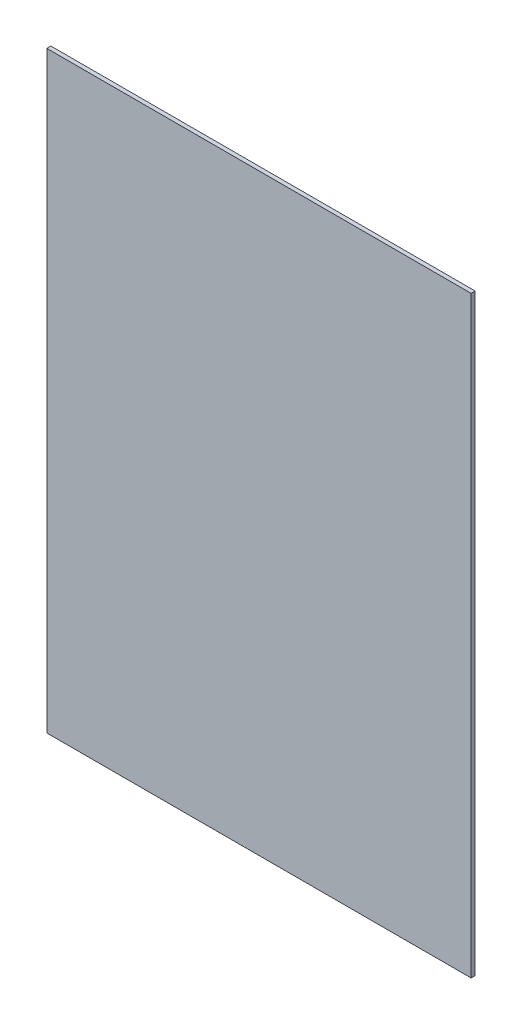
ISO-10303-21;
HEADER;
FILE_DESCRIPTION(('STEP AP214'),'2;1');
FILE_NAME('part.step','',(''),(''),'','','');
FILE_SCHEMA(('AUTOMOTIVE_DESIGN { 1 0 10303 214 1 1 1 1 }'));
ENDSEC;
DATA;
#1=APPLICATION_CONTEXT('core data for automotive mechanical design processes');
#2=APPLICATION_PROTOCOL_DEFINITION('international standard','automotive_design',2000,#1);
#3=PRODUCT_CONTEXT('',#1,'mechanical');
#4=PRODUCT('Part','Part','',(#3));
#5=PRODUCT_RELATED_PRODUCT_CATEGORY('part','',(#4));
#6=PRODUCT_DEFINITION_FORMATION('','',#4);
#7=PRODUCT_DEFINITION_CONTEXT('part definition',#1,'design');
#8=PRODUCT_DEFINITION('design','',#6,#7);
#9=PRODUCT_DEFINITION_SHAPE('','',#8);
#10=(LENGTH_UNIT() NAMED_UNIT(*) SI_UNIT(.MILLI.,.METRE.));
#11=(NAMED_UNIT(*) PLANE_ANGLE_UNIT() SI_UNIT($,.RADIAN.));
#12=(NAMED_UNIT(*) SI_UNIT($,.STERADIAN.) SOLID_ANGLE_UNIT());
#13=UNCERTAINTY_MEASURE_WITH_UNIT(LENGTH_MEASURE(1.E-05),#10,'distance_accuracy_value','');
#14=(GEOMETRIC_REPRESENTATION_CONTEXT(3) GLOBAL_UNCERTAINTY_ASSIGNED_CONTEXT((#13)) GLOBAL_UNIT_ASSIGNED_CONTEXT((#10,
#11,#12)) REPRESENTATION_CONTEXT('',''));
#15=CARTESIAN_POINT('',(0.,0.,0.));
#16=DIRECTION('',(0.,0.,1.));
#17=DIRECTION('',(1.,0.,0.));
#18=AXIS2_PLACEMENT_3D('',#15,#16,#17);
#19=CARTESIAN_POINT('',(340.,-475.,6.5));
#20=DIRECTION('',(-1.,0.,0.));
#21=DIRECTION('',(0.,0.,1.));
#22=AXIS2_PLACEMENT_3D('',#19,#20,#21);
#23=PLANE('',#22);
#24=DIRECTION('',(0.,1.,0.));
#25=VECTOR('',#24,1.);
#26=CARTESIAN_POINT('',(340.,-475.,0.));
#27=LINE('',#26,#25);
#28=CARTESIAN_POINT('',(340.,-475.,0.));
#29=VERTEX_POINT('',#28);
#30=CARTESIAN_POINT('',(340.,475.,0.));
#31=VERTEX_POINT('',#30);
#32=EDGE_CURVE('E95',#29,#31,#27,.T.);
#33=ORIENTED_EDGE('',*,*,#32,.T.);
#34=DIRECTION('',(0.,0.,-1.));
#35=VECTOR('',#34,1.);
#36=CARTESIAN_POINT('',(340.,475.,6.5));
#37=LINE('',#36,#35);
#38=CARTESIAN_POINT('',(340.,475.,6.5));
#39=VERTEX_POINT('',#38);
#40=EDGE_CURVE('E11',#39,#31,#37,.T.);
#41=ORIENTED_EDGE('',*,*,#40,.F.);
#42=DIRECTION('',(0.,1.,0.));
#43=VECTOR('',#42,1.);
#44=CARTESIAN_POINT('',(340.,-475.,6.5));
#45=LINE('',#44,#43);
#46=CARTESIAN_POINT('',(340.,-475.,6.5));
#47=VERTEX_POINT('',#46);
#48=EDGE_CURVE('E83',#47,#39,#45,.T.);
#49=ORIENTED_EDGE('',*,*,#48,.F.);
#50=DIRECTION('',(0.,0.,-1.));
#51=VECTOR('',#50,1.);
#52=CARTESIAN_POINT('',(340.,-475.,6.5));
#53=LINE('',#52,#51);
#54=EDGE_CURVE('E91',#47,#29,#53,.T.);
#55=ORIENTED_EDGE('',*,*,#54,.T.);
#56=EDGE_LOOP('',(#33,#41,#49,#55));
#57=FACE_BOUND('',#56,.T.);
#58=ADVANCED_FACE('F32',(#57),#23,.F.);
#59=CARTESIAN_POINT('',(-340.,475.,6.5));
#60=DIRECTION('',(0.,-1.,0.));
#61=DIRECTION('',(0.,0.,-1.));
#62=AXIS2_PLACEMENT_3D('',#59,#60,#61);
#63=PLANE('',#62);
#64=DIRECTION('',(-1.,0.,0.));
#65=VECTOR('',#64,1.);
#66=CARTESIAN_POINT('',(-340.,475.,0.));
#67=LINE('',#66,#65);
#68=CARTESIAN_POINT('',(-340.,475.,0.));
#69=VERTEX_POINT('',#68);
#70=EDGE_CURVE('E87',#31,#69,#67,.T.);
#71=ORIENTED_EDGE('',*,*,#70,.T.);
#72=DIRECTION('',(0.,0.,-1.));
#73=VECTOR('',#72,1.);
#74=CARTESIAN_POINT('',(-340.,475.,6.5));
#75=LINE('',#74,#73);
#76=CARTESIAN_POINT('',(-340.,475.,6.5));
#77=VERTEX_POINT('',#76);
#78=EDGE_CURVE('E40',#77,#69,#75,.T.);
#79=ORIENTED_EDGE('',*,*,#78,.F.);
#80=DIRECTION('',(-1.,0.,0.));
#81=VECTOR('',#80,1.);
#82=CARTESIAN_POINT('',(-340.,475.,6.5));
#83=LINE('',#82,#81);
#84=EDGE_CURVE('E78',#39,#77,#83,.T.);
#85=ORIENTED_EDGE('',*,*,#84,.F.);
#86=ORIENTED_EDGE('',*,*,#40,.T.);
#87=EDGE_LOOP('',(#71,#79,#85,#86));
#88=FACE_BOUND('',#87,.T.);
#89=ADVANCED_FACE('F86',(#88),#63,.F.);
#90=CARTESIAN_POINT('',(-340.,-475.,6.5));
#91=DIRECTION('',(1.,0.,0.));
#92=DIRECTION('',(0.,0.,-1.));
#93=AXIS2_PLACEMENT_3D('',#90,#91,#92);
#94=PLANE('',#93);
#95=DIRECTION('',(0.,-1.,0.));
#96=VECTOR('',#95,1.);
#97=CARTESIAN_POINT('',(-340.,-475.,0.));
#98=LINE('',#97,#96);
#99=CARTESIAN_POINT('',(-340.,-475.,0.));
#100=VERTEX_POINT('',#99);
#101=EDGE_CURVE('E65',#69,#100,#98,.T.);
#102=ORIENTED_EDGE('',*,*,#101,.T.);
#103=DIRECTION('',(0.,0.,-1.));
#104=VECTOR('',#103,1.);
#105=CARTESIAN_POINT('',(-340.,-475.,6.5));
#106=LINE('',#105,#104);
#107=CARTESIAN_POINT('',(-340.,-475.,6.5));
#108=VERTEX_POINT('',#107);
#109=EDGE_CURVE('E88',#108,#100,#106,.T.);
#110=ORIENTED_EDGE('',*,*,#109,.F.);
#111=DIRECTION('',(0.,-1.,0.));
#112=VECTOR('',#111,1.);
#113=CARTESIAN_POINT('',(-340.,-475.,6.5));
#114=LINE('',#113,#112);
#115=EDGE_CURVE('E81',#77,#108,#114,.T.);
#116=ORIENTED_EDGE('',*,*,#115,.F.);
#117=ORIENTED_EDGE('',*,*,#78,.T.);
#118=EDGE_LOOP('',(#102,#110,#116,#117));
#119=FACE_BOUND('',#118,.T.);
#120=ADVANCED_FACE('F89',(#119),#94,.F.);
#121=CARTESIAN_POINT('',(-340.,-475.,6.5));
#122=DIRECTION('',(0.,1.,0.));
#123=DIRECTION('',(0.,0.,1.));
#124=AXIS2_PLACEMENT_3D('',#121,#122,#123);
#125=PLANE('',#124);
#126=DIRECTION('',(1.,0.,0.));
#127=VECTOR('',#126,1.);
#128=CARTESIAN_POINT('',(-340.,-475.,0.));
#129=LINE('',#128,#127);
#130=EDGE_CURVE('E71',#100,#29,#129,.T.);
#131=ORIENTED_EDGE('',*,*,#130,.T.);
#132=ORIENTED_EDGE('',*,*,#54,.F.);
#133=DIRECTION('',(1.,0.,0.));
#134=VECTOR('',#133,1.);
#135=CARTESIAN_POINT('',(-340.,-475.,6.5));
#136=LINE('',#135,#134);
#137=EDGE_CURVE('E48',#108,#47,#136,.T.);
#138=ORIENTED_EDGE('',*,*,#137,.F.);
#139=ORIENTED_EDGE('',*,*,#109,.T.);
#140=EDGE_LOOP('',(#131,#132,#138,#139));
#141=FACE_BOUND('',#140,.T.);
#142=ADVANCED_FACE('F102',(#141),#125,.F.);
#143=CARTESIAN_POINT('',(0.,0.,6.5));
#144=DIRECTION('',(0.,0.,-1.));
#145=DIRECTION('',(-1.,0.,0.));
#146=AXIS2_PLACEMENT_3D('',#143,#144,#145);
#147=PLANE('',#146);
#148=ORIENTED_EDGE('',*,*,#48,.T.);
#149=ORIENTED_EDGE('',*,*,#84,.T.);
#150=ORIENTED_EDGE('',*,*,#115,.T.);
#151=ORIENTED_EDGE('',*,*,#137,.T.);
#152=EDGE_LOOP('',(#148,#149,#150,#151));
#153=FACE_BOUND('',#152,.T.);
#154=ADVANCED_FACE('F79',(#153),#147,.F.);
#155=CARTESIAN_POINT('',(0.,0.,0.));
#156=DIRECTION('',(0.,0.,-1.));
#157=DIRECTION('',(-1.,0.,0.));
#158=AXIS2_PLACEMENT_3D('',#155,#156,#157);
#159=PLANE('',#158);
#160=ORIENTED_EDGE('',*,*,#32,.F.);
#161=ORIENTED_EDGE('',*,*,#130,.F.);
#162=ORIENTED_EDGE('',*,*,#101,.F.);
#163=ORIENTED_EDGE('',*,*,#70,.F.);
#164=EDGE_LOOP('',(#160,#161,#162,#163));
#165=FACE_BOUND('',#164,.T.);
#166=ADVANCED_FACE('F105',(#165),#159,.T.);
#167=CLOSED_SHELL('',(#58,#89,#120,#142,#154,#166));
#168=MANIFOLD_SOLID_BREP('B2',#167);
#169=ADVANCED_BREP_SHAPE_REPRESENTATION('',(#18,#168),#14);
#170=SHAPE_DEFINITION_REPRESENTATION(#9,#169);
ENDSEC;
END-ISO-10303-21;
